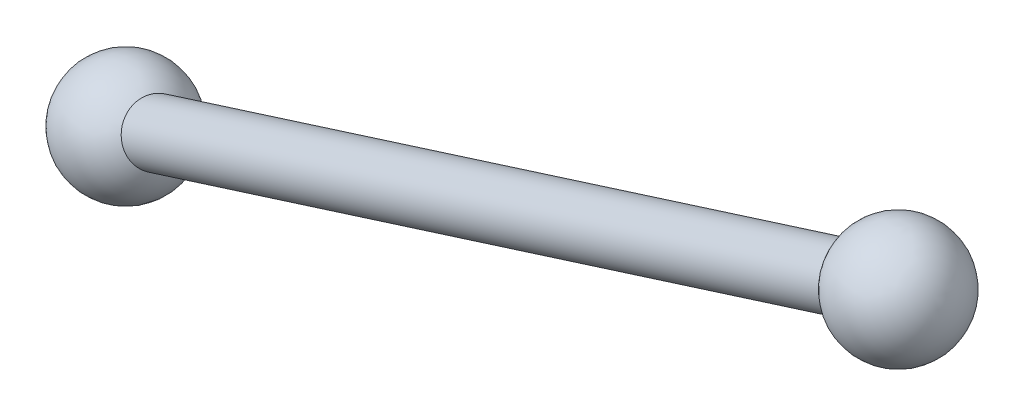
ISO-10303-21;
HEADER;
FILE_DESCRIPTION(('STEP AP214'),'2;1');
FILE_NAME('part.step','',(''),(''),'','','');
FILE_SCHEMA(('AUTOMOTIVE_DESIGN { 1 0 10303 214 1 1 1 1 }'));
ENDSEC;
DATA;
#1=APPLICATION_CONTEXT('core data for automotive mechanical design processes');
#2=APPLICATION_PROTOCOL_DEFINITION('international standard','automotive_design',2000,#1);
#3=PRODUCT_CONTEXT('',#1,'mechanical');
#4=PRODUCT('Part','Part','',(#3));
#5=PRODUCT_RELATED_PRODUCT_CATEGORY('part','',(#4));
#6=PRODUCT_DEFINITION_FORMATION('','',#4);
#7=PRODUCT_DEFINITION_CONTEXT('part definition',#1,'design');
#8=PRODUCT_DEFINITION('design','',#6,#7);
#9=PRODUCT_DEFINITION_SHAPE('','',#8);
#10=(LENGTH_UNIT() NAMED_UNIT(*) SI_UNIT(.MILLI.,.METRE.));
#11=(NAMED_UNIT(*) PLANE_ANGLE_UNIT() SI_UNIT($,.RADIAN.));
#12=(NAMED_UNIT(*) SI_UNIT($,.STERADIAN.) SOLID_ANGLE_UNIT());
#13=UNCERTAINTY_MEASURE_WITH_UNIT(LENGTH_MEASURE(1.E-05),#10,'distance_accuracy_value','');
#14=(GEOMETRIC_REPRESENTATION_CONTEXT(3) GLOBAL_UNCERTAINTY_ASSIGNED_CONTEXT((#13)) GLOBAL_UNIT_ASSIGNED_CONTEXT((#10,
#11,#12)) REPRESENTATION_CONTEXT('',''));
#15=CARTESIAN_POINT('',(0.,0.,0.));
#16=DIRECTION('',(0.,0.,1.));
#17=DIRECTION('',(1.,0.,0.));
#18=AXIS2_PLACEMENT_3D('',#15,#16,#17);
#19=CARTESIAN_POINT('',(-82.272413359275,-101.000000000529,-14.9999999999275));
#20=DIRECTION('',(0.,0.,-1.));
#21=DIRECTION('',(-1.,0.,0.));
#22=AXIS2_PLACEMENT_3D('',#19,#20,#21);
#23=SPHERICAL_SURFACE('',#22,3.);
#24=CARTESIAN_POINT('',(-82.272413359275,-101.000000000529,-14.9999999999275));
#25=DIRECTION('',(-0.869739963853115,-0.435019425763827,-0.233046120939382));
#26=DIRECTION('',(0.447336531418006,-0.894365712479468,0.));
#27=AXIS2_PLACEMENT_3D('',#24,#25,#26);
#28=SPHERICAL_SURFACE('',#27,3.);
#29=CARTESIAN_POINT('',(-80.0127626491249,-99.8697863789751,-14.3945284169668));
#30=DIRECTION('',(-0.869739963853112,-0.435019425763826,-0.233046120939381));
#31=DIRECTION('',(0.447336531418006,-0.894365712479468,0.));
#32=AXIS2_PLACEMENT_3D('',#29,#30,#31);
#33=CIRCLE('',#32,1.5);
#34=CARTESIAN_POINT('',(-80.6837674462519,-98.5282378102559,-14.3945284169668));
#35=VERTEX_POINT('',#34);
#36=EDGE_CURVE('E43',#35,#35,#33,.F.);
#37=ORIENTED_EDGE('',*,*,#36,.F.);
#38=EDGE_LOOP('',(#37));
#39=FACE_BOUND('',#38,.T.);
#40=ADVANCED_FACE('F39',(#39),#28,.T.);
#41=CARTESIAN_POINT('',(-26.29165124598,-73.,0.));
#42=DIRECTION('',(0.,0.,-1.));
#43=DIRECTION('',(-1.,0.,0.));
#44=AXIS2_PLACEMENT_3D('',#41,#42,#43);
#45=SPHERICAL_SURFACE('',#44,3.);
#46=CARTESIAN_POINT('',(-26.29165124598,-73.,0.));
#47=DIRECTION('',(0.869739963853115,0.435019425763826,0.233046120939381));
#48=DIRECTION('',(-0.447336531418005,0.894365712479469,0.));
#49=AXIS2_PLACEMENT_3D('',#46,#47,#48);
#50=SPHERICAL_SURFACE('',#49,3.);
#51=CARTESIAN_POINT('',(-28.5513019561301,-74.1302136215536,-0.605471582960778));
#52=DIRECTION('',(0.869739963853115,0.435019425763826,0.233046120939381));
#53=DIRECTION('',(-0.447336531418005,0.894365712479469,0.));
#54=AXIS2_PLACEMENT_3D('',#51,#52,#53);
#55=CIRCLE('',#54,1.5);
#56=CARTESIAN_POINT('',(-29.2223067532571,-72.7886650528344,-0.605471582960778));
#57=VERTEX_POINT('',#56);
#58=EDGE_CURVE('E10',#57,#57,#55,.F.);
#59=ORIENTED_EDGE('',*,*,#58,.F.);
#60=EDGE_LOOP('',(#59));
#61=FACE_BOUND('',#60,.T.);
#62=ADVANCED_FACE('F53',(#61),#50,.T.);
#63=CARTESIAN_POINT('',(-82.272413359275,-101.000000000529,-14.9999999999275));
#64=DIRECTION('',(0.869739963853115,0.435019425763827,0.233046120939381));
#65=DIRECTION('',(-0.447336531418006,0.894365712479469,0.));
#66=AXIS2_PLACEMENT_3D('',#63,#64,#65);
#67=CYLINDRICAL_SURFACE('',#66,1.5);
#68=CARTESIAN_POINT('',(-80.6837674462519,-98.5282378102559,-14.3945284169668));
#69=CARTESIAN_POINT('',(-80.1477105640332,-98.2601172606994,-14.2508924082792));
#70=CARTESIAN_POINT('',(-79.6116536818145,-97.9919967111429,-14.1072563995916));
#71=CARTESIAN_POINT('',(-78.5395399173772,-97.45575561203,-13.8199843822165));
#72=CARTESIAN_POINT('',(-78.0034830351585,-97.1876350624735,-13.6763483735289));
#73=CARTESIAN_POINT('',(-76.9313692707211,-96.6513939633606,-13.3890763561538));
#74=CARTESIAN_POINT('',(-76.3953123885024,-96.3832734138041,-13.2454403474663));
#75=CARTESIAN_POINT('',(-75.323198624065,-95.8470323146911,-12.9581683300911));
#76=CARTESIAN_POINT('',(-74.7871417418463,-95.5789117651346,-12.8145323214036));
#77=CARTESIAN_POINT('',(-73.7150279774089,-95.0426706660217,-12.5272603040284));
#78=CARTESIAN_POINT('',(-73.1789710951902,-94.7745501164652,-12.3836242953409));
#79=CARTESIAN_POINT('',(-72.1068573307528,-94.2383090173523,-12.0963522779658));
#80=CARTESIAN_POINT('',(-71.5708004485341,-93.9701884677958,-11.9527162692782));
#81=CARTESIAN_POINT('',(-70.4986866840967,-93.4339473686829,-11.6654442519031));
#82=CARTESIAN_POINT('',(-69.962629801878,-93.1658268191264,-11.5218082432155));
#83=CARTESIAN_POINT('',(-68.8905160374406,-92.6295857200135,-11.2345362258404));
#84=CARTESIAN_POINT('',(-68.3544591552219,-92.361465170457,-11.0909002171528));
#85=CARTESIAN_POINT('',(-67.2823453907845,-91.825224071344,-10.8036281997777));
#86=CARTESIAN_POINT('',(-66.7462885085658,-91.5571035217875,-10.6599921910901));
#87=CARTESIAN_POINT('',(-65.6741747441284,-91.0208624226746,-10.372720173715));
#88=CARTESIAN_POINT('',(-65.1381178619097,-90.7527418731181,-10.2290841650274));
#89=CARTESIAN_POINT('',(-64.0660040974723,-90.2165007740052,-9.94181214765232));
#90=CARTESIAN_POINT('',(-63.5299472152536,-89.9483802244487,-9.79817613896476));
#91=CARTESIAN_POINT('',(-62.4578334508163,-89.4121391253358,-9.51090412158964));
#92=CARTESIAN_POINT('',(-61.9217765685976,-89.1440185757793,-9.36726811290207));
#93=CARTESIAN_POINT('',(-60.8496628041602,-88.6077774766663,-9.07999609552695));
#94=CARTESIAN_POINT('',(-60.3136059219415,-88.3396569271099,-8.93636008683939));
#95=CARTESIAN_POINT('',(-59.2414921575041,-87.8034158279969,-8.64908806946426));
#96=CARTESIAN_POINT('',(-58.7054352752854,-87.5352952784404,-8.5054520607767));
#97=CARTESIAN_POINT('',(-57.633321510848,-86.9990541793275,-8.21818004340158));
#98=CARTESIAN_POINT('',(-57.0972646286293,-86.730933629771,-8.07454403471401));
#99=CARTESIAN_POINT('',(-56.0251508641919,-86.1946925306581,-7.78727201733889));
#100=CARTESIAN_POINT('',(-55.4890939819732,-85.9265719811016,-7.64363600865133));
#101=CARTESIAN_POINT('',(-54.4169802175358,-85.3903308819887,-7.3563639912762));
#102=CARTESIAN_POINT('',(-53.8809233353171,-85.1222103324322,-7.21272798258864));
#103=CARTESIAN_POINT('',(-52.8088095708797,-84.5859692333192,-6.92545596521351));
#104=CARTESIAN_POINT('',(-52.272752688661,-84.3178486837628,-6.78181995652595));
#105=CARTESIAN_POINT('',(-51.2006389242236,-83.7816075846498,-6.49454793915083));
#106=CARTESIAN_POINT('',(-50.6645820420049,-83.5134870350933,-6.35091193046327));
#107=CARTESIAN_POINT('',(-49.5924682775675,-82.9772459359804,-6.06363991308814));
#108=CARTESIAN_POINT('',(-49.0564113953488,-82.7091253864239,-5.92000390440058));
#109=CARTESIAN_POINT('',(-47.9842976309115,-82.172884287311,-5.63273188702546));
#110=CARTESIAN_POINT('',(-47.4482407486928,-81.9047637377545,-5.48909587833789));
#111=CARTESIAN_POINT('',(-46.3761269842554,-81.3685226386416,-5.20182386096277));
#112=CARTESIAN_POINT('',(-45.8400701020367,-81.1004020890851,-5.05818785227521));
#113=CARTESIAN_POINT('',(-44.7679563375993,-80.5641609899721,-4.77091583490008));
#114=CARTESIAN_POINT('',(-44.2318994553806,-80.2960404404157,-4.62727982621252));
#115=CARTESIAN_POINT('',(-43.1597856909432,-79.7597993413027,-4.34000780883739));
#116=CARTESIAN_POINT('',(-42.6237288087245,-79.4916787917462,-4.19637180014983));
#117=CARTESIAN_POINT('',(-41.5516150442871,-78.9554376926333,-3.90909978277471));
#118=CARTESIAN_POINT('',(-41.0155581620684,-78.6873171430768,-3.76546377408715));
#119=CARTESIAN_POINT('',(-39.943444397631,-78.1510760439639,-3.47819175671202));
#120=CARTESIAN_POINT('',(-39.4073875154123,-77.8829554944074,-3.33455574802446));
#121=CARTESIAN_POINT('',(-38.3352737509749,-77.3467143952944,-3.04728373064934));
#122=CARTESIAN_POINT('',(-37.7992168687562,-77.078593845738,-2.90364772196177));
#123=CARTESIAN_POINT('',(-36.7271031043188,-76.542352746625,-2.61637570458665));
#124=CARTESIAN_POINT('',(-36.1910462221001,-76.2742321970686,-2.47273969589909));
#125=CARTESIAN_POINT('',(-35.1189324576627,-75.7379910979556,-2.18546767852396));
#126=CARTESIAN_POINT('',(-34.582875575444,-75.4698705483991,-2.0418316698364));
#127=CARTESIAN_POINT('',(-33.5107618110067,-74.9336294492862,-1.75455965246128));
#128=CARTESIAN_POINT('',(-32.974704928788,-74.6655088997297,-1.61092364377371));
#129=CARTESIAN_POINT('',(-31.9025911643506,-74.1292678006168,-1.32365162639859));
#130=CARTESIAN_POINT('',(-31.3665342821319,-73.8611472510603,-1.18001561771103));
#131=CARTESIAN_POINT('',(-30.2944205176945,-73.3249061519473,-0.892743600335902));
#132=CARTESIAN_POINT('',(-29.7583636354758,-73.0567856023909,-0.74910759164834));
#133=CARTESIAN_POINT('',(-29.2223067532571,-72.7886650528344,-0.605471582960778));
#134=B_SPLINE_CURVE_WITH_KNOTS('',3,(#68,#69,#70,#71,#72,#73,#74,#75,#76,#77,#78,#79,#80,#81,
#82,#83,#84,#85,#86,#87,#88,#89,#90,#91,#92,#93,#94,#95,#96,#97,#98,#99,#100,#101,#102,#103,
#104,#105,#106,#107,#108,#109,#110,#111,#112,#113,#114,#115,#116,#117,#118,#119,#120,#121,#122,
#123,#124,#125,#126,#127,#128,#129,#130,#131,#132,#133),.UNSPECIFIED.,.F.,.F.,(4,2,2,2,2,2,2,2,
2,2,2,2,2,2,2,2,2,2,2,2,2,2,2,2,2,2,2,2,2,2,2,2,4),(0.,1.84902466655848,3.69804933311696,
5.54707399967544,7.39609866623391,9.24512333279239,11.0941479993509,12.9431726659093,
14.7921973324678,16.6412219990263,18.4902466655848,20.3392713321433,22.1882959987017,
24.0373206652602,25.8863453318187,27.7353699983772,29.5843946649357,31.4334193314941,
33.2824439980526,35.1314686646111,36.9804933311696,38.8295179977281,40.6785426642865,
42.527567330845,44.3765919974035,46.225616663962,48.0746413305204,49.9236659970789,
51.7726906636374,53.6217153301959,55.4707399967543,57.3197646633128,59.1687893298713),.UNSPECIFIED.);
#135=EDGE_CURVE('BSEAM41',#35,#57,#134,.T.);
#136=ORIENTED_EDGE('',*,*,#36,.T.);
#137=ORIENTED_EDGE('',*,*,#58,.T.);
#138=ORIENTED_EDGE('',*,*,#135,.T.);
#139=ORIENTED_EDGE('',*,*,#135,.F.);
#140=EDGE_LOOP('',(#136,#138,#137,#139));
#141=FACE_BOUND('',#140,.T.);
#142=ADVANCED_FACE('F41',(#141),#67,.T.);
#143=CLOSED_SHELL('',(#40,#62,#142));
#144=MANIFOLD_SOLID_BREP('B2',#143);
#145=ADVANCED_BREP_SHAPE_REPRESENTATION('',(#18,#144),#14);
#146=SHAPE_DEFINITION_REPRESENTATION(#9,#145);
ENDSEC;
END-ISO-10303-21;
